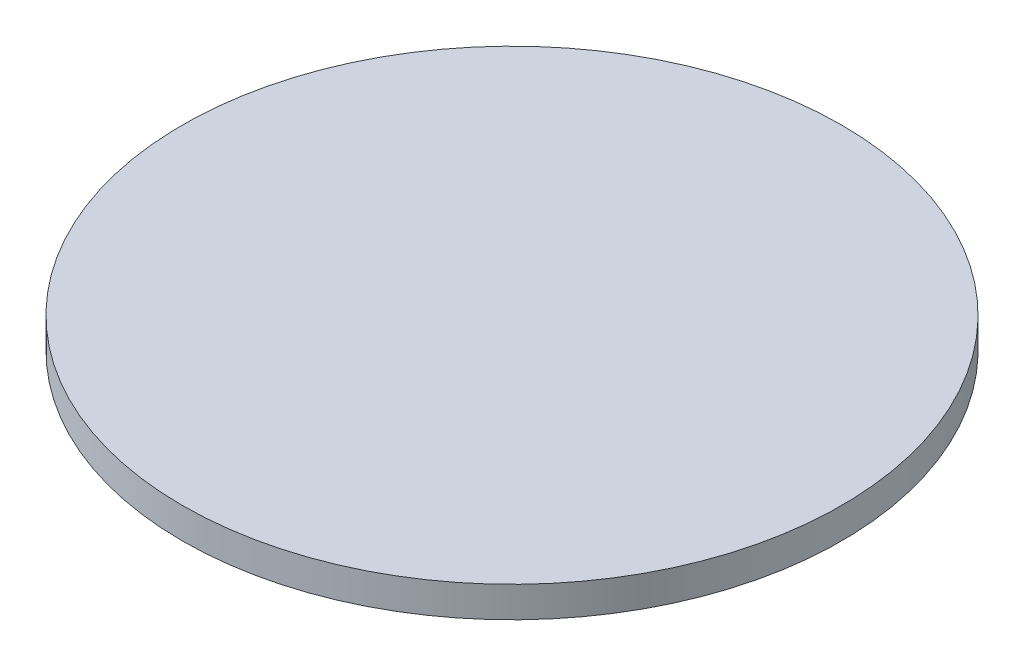
ISO-10303-21;
HEADER;
FILE_DESCRIPTION(('STEP AP214'),'2;1');
FILE_NAME('part.step','',(''),(''),'','','');
FILE_SCHEMA(('AUTOMOTIVE_DESIGN { 1 0 10303 214 1 1 1 1 }'));
ENDSEC;
DATA;
#1=APPLICATION_CONTEXT('core data for automotive mechanical design processes');
#2=APPLICATION_PROTOCOL_DEFINITION('international standard','automotive_design',2000,#1);
#3=PRODUCT_CONTEXT('',#1,'mechanical');
#4=PRODUCT('Part','Part','',(#3));
#5=PRODUCT_RELATED_PRODUCT_CATEGORY('part','',(#4));
#6=PRODUCT_DEFINITION_FORMATION('','',#4);
#7=PRODUCT_DEFINITION_CONTEXT('part definition',#1,'design');
#8=PRODUCT_DEFINITION('design','',#6,#7);
#9=PRODUCT_DEFINITION_SHAPE('','',#8);
#10=(LENGTH_UNIT() NAMED_UNIT(*) SI_UNIT(.MILLI.,.METRE.));
#11=(NAMED_UNIT(*) PLANE_ANGLE_UNIT() SI_UNIT($,.RADIAN.));
#12=(NAMED_UNIT(*) SI_UNIT($,.STERADIAN.) SOLID_ANGLE_UNIT());
#13=UNCERTAINTY_MEASURE_WITH_UNIT(LENGTH_MEASURE(1.E-05),#10,'distance_accuracy_value','');
#14=(GEOMETRIC_REPRESENTATION_CONTEXT(3) GLOBAL_UNCERTAINTY_ASSIGNED_CONTEXT((#13)) GLOBAL_UNIT_ASSIGNED_CONTEXT((#10,
#11,#12)) REPRESENTATION_CONTEXT('',''));
#15=CARTESIAN_POINT('',(0.,0.,0.));
#16=DIRECTION('',(0.,0.,1.));
#17=DIRECTION('',(1.,0.,0.));
#18=AXIS2_PLACEMENT_3D('',#15,#16,#17);
#19=CARTESIAN_POINT('',(0.,1.5,0.));
#20=DIRECTION('',(0.,-1.,0.));
#21=DIRECTION('',(0.,0.,-1.));
#22=AXIS2_PLACEMENT_3D('',#19,#20,#21);
#23=CYLINDRICAL_SURFACE('',#22,16.0729880916987);
#24=CARTESIAN_POINT('',(0.,1.5,0.));
#25=DIRECTION('',(0.,1.,0.));
#26=DIRECTION('',(0.,0.,1.));
#27=AXIS2_PLACEMENT_3D('',#24,#25,#26);
#28=CIRCLE('',#27,16.0729880916987);
#29=CARTESIAN_POINT('',(0.,1.5,16.0729880916987));
#30=VERTEX_POINT('',#29);
#31=EDGE_CURVE('E10',#30,#30,#28,.T.);
#32=ORIENTED_EDGE('',*,*,#31,.F.);
#33=EDGE_LOOP('',(#32));
#34=FACE_BOUND('',#33,.T.);
#35=CARTESIAN_POINT('',(0.,0.,0.));
#36=DIRECTION('',(0.,1.,0.));
#37=DIRECTION('',(0.,0.,1.));
#38=AXIS2_PLACEMENT_3D('',#35,#36,#37);
#39=CIRCLE('',#38,16.0729880916987);
#40=CARTESIAN_POINT('',(0.,0.,16.0729880916987));
#41=VERTEX_POINT('',#40);
#42=EDGE_CURVE('E46',#41,#41,#39,.T.);
#43=ORIENTED_EDGE('',*,*,#42,.T.);
#44=EDGE_LOOP('',(#43));
#45=FACE_BOUND('',#44,.T.);
#46=ADVANCED_FACE('F43',(#34,#45),#23,.T.);
#47=CARTESIAN_POINT('',(0.,1.5,0.));
#48=DIRECTION('',(0.,1.,0.));
#49=DIRECTION('',(0.,0.,1.));
#50=AXIS2_PLACEMENT_3D('',#47,#48,#49);
#51=PLANE('',#50);
#52=ORIENTED_EDGE('',*,*,#31,.T.);
#53=EDGE_LOOP('',(#52));
#54=FACE_BOUND('',#53,.T.);
#55=ADVANCED_FACE('F58',(#54),#51,.T.);
#56=CARTESIAN_POINT('',(0.,0.,0.));
#57=DIRECTION('',(0.,1.,0.));
#58=DIRECTION('',(0.,0.,1.));
#59=AXIS2_PLACEMENT_3D('',#56,#57,#58);
#60=PLANE('',#59);
#61=ORIENTED_EDGE('',*,*,#42,.F.);
#62=EDGE_LOOP('',(#61));
#63=FACE_BOUND('',#62,.T.);
#64=ADVANCED_FACE('F56',(#63),#60,.F.);
#65=CLOSED_SHELL('',(#46,#55,#64));
#66=MANIFOLD_SOLID_BREP('B2',#65);
#67=ADVANCED_BREP_SHAPE_REPRESENTATION('',(#18,#66),#14);
#68=SHAPE_DEFINITION_REPRESENTATION(#9,#67);
ENDSEC;
END-ISO-10303-21;
